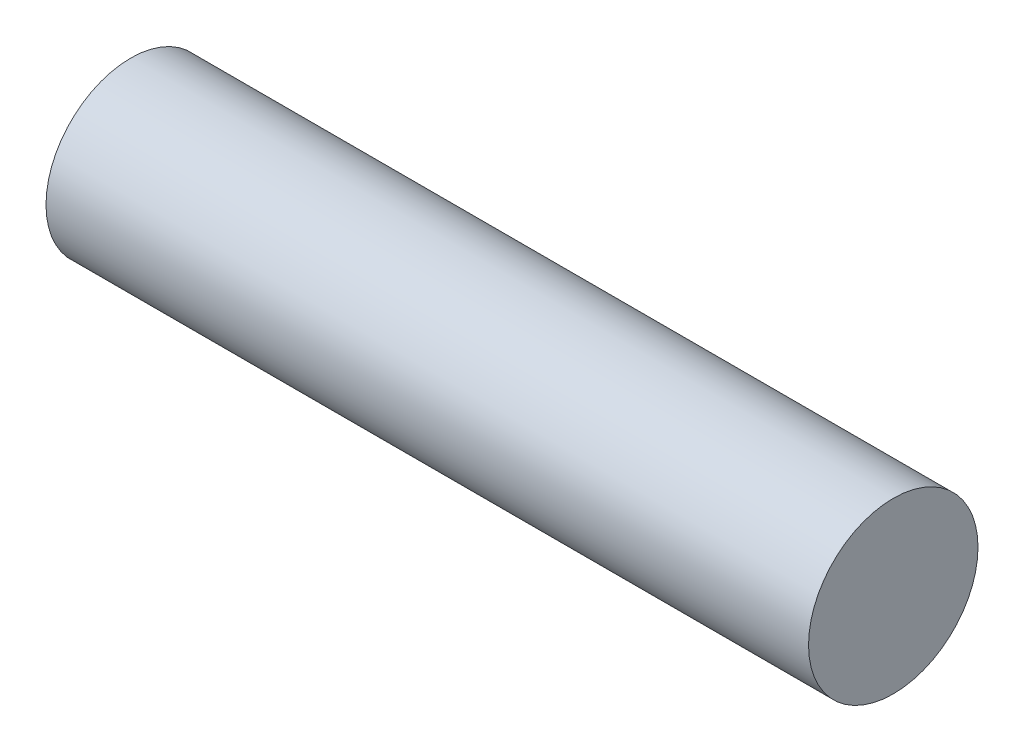
ISO-10303-21;
HEADER;
FILE_DESCRIPTION(('STEP AP214'),'2;1');
FILE_NAME('part.step','',(''),(''),'','','');
FILE_SCHEMA(('AUTOMOTIVE_DESIGN { 1 0 10303 214 1 1 1 1 }'));
ENDSEC;
DATA;
#1=APPLICATION_CONTEXT('core data for automotive mechanical design processes');
#2=APPLICATION_PROTOCOL_DEFINITION('international standard','automotive_design',2000,#1);
#3=PRODUCT_CONTEXT('',#1,'mechanical');
#4=PRODUCT('Part','Part','',(#3));
#5=PRODUCT_RELATED_PRODUCT_CATEGORY('part','',(#4));
#6=PRODUCT_DEFINITION_FORMATION('','',#4);
#7=PRODUCT_DEFINITION_CONTEXT('part definition',#1,'design');
#8=PRODUCT_DEFINITION('design','',#6,#7);
#9=PRODUCT_DEFINITION_SHAPE('','',#8);
#10=(LENGTH_UNIT() NAMED_UNIT(*) SI_UNIT(.MILLI.,.METRE.));
#11=(NAMED_UNIT(*) PLANE_ANGLE_UNIT() SI_UNIT($,.RADIAN.));
#12=(NAMED_UNIT(*) SI_UNIT($,.STERADIAN.) SOLID_ANGLE_UNIT());
#13=UNCERTAINTY_MEASURE_WITH_UNIT(LENGTH_MEASURE(1.E-05),#10,'distance_accuracy_value','');
#14=(GEOMETRIC_REPRESENTATION_CONTEXT(3) GLOBAL_UNCERTAINTY_ASSIGNED_CONTEXT((#13)) GLOBAL_UNIT_ASSIGNED_CONTEXT((#10,
#11,#12)) REPRESENTATION_CONTEXT('',''));
#15=CARTESIAN_POINT('',(0.,0.,0.));
#16=DIRECTION('',(0.,0.,1.));
#17=DIRECTION('',(1.,0.,0.));
#18=AXIS2_PLACEMENT_3D('',#15,#16,#17);
#19=CARTESIAN_POINT('',(28.575,0.,0.));
#20=DIRECTION('',(-1.,0.,0.));
#21=DIRECTION('',(0.,0.,1.));
#22=AXIS2_PLACEMENT_3D('',#19,#20,#21);
#23=CYLINDRICAL_SURFACE('',#22,6.35);
#24=CARTESIAN_POINT('',(28.575,0.,0.));
#25=DIRECTION('',(1.,0.,0.));
#26=DIRECTION('',(0.,0.,-1.));
#27=AXIS2_PLACEMENT_3D('',#24,#25,#26);
#28=CIRCLE('',#27,6.35);
#29=CARTESIAN_POINT('',(28.575,0.,-6.35));
#30=VERTEX_POINT('',#29);
#31=EDGE_CURVE('E10',#30,#30,#28,.T.);
#32=ORIENTED_EDGE('',*,*,#31,.F.);
#33=EDGE_LOOP('',(#32));
#34=FACE_BOUND('',#33,.T.);
#35=CARTESIAN_POINT('',(-28.575,0.,0.));
#36=DIRECTION('',(1.,0.,0.));
#37=DIRECTION('',(0.,0.,-1.));
#38=AXIS2_PLACEMENT_3D('',#35,#36,#37);
#39=CIRCLE('',#38,6.35);
#40=CARTESIAN_POINT('',(-28.575,0.,-6.35));
#41=VERTEX_POINT('',#40);
#42=EDGE_CURVE('E34',#41,#41,#39,.T.);
#43=ORIENTED_EDGE('',*,*,#42,.T.);
#44=EDGE_LOOP('',(#43));
#45=FACE_BOUND('',#44,.T.);
#46=ADVANCED_FACE('F31',(#34,#45),#23,.T.);
#47=CARTESIAN_POINT('',(28.575,0.,0.));
#48=DIRECTION('',(1.,0.,0.));
#49=DIRECTION('',(0.,0.,-1.));
#50=AXIS2_PLACEMENT_3D('',#47,#48,#49);
#51=PLANE('',#50);
#52=ORIENTED_EDGE('',*,*,#31,.T.);
#53=EDGE_LOOP('',(#52));
#54=FACE_BOUND('',#53,.T.);
#55=ADVANCED_FACE('F46',(#54),#51,.T.);
#56=CARTESIAN_POINT('',(-28.575,0.,0.));
#57=DIRECTION('',(1.,0.,0.));
#58=DIRECTION('',(0.,0.,-1.));
#59=AXIS2_PLACEMENT_3D('',#56,#57,#58);
#60=PLANE('',#59);
#61=ORIENTED_EDGE('',*,*,#42,.F.);
#62=EDGE_LOOP('',(#61));
#63=FACE_BOUND('',#62,.T.);
#64=ADVANCED_FACE('F44',(#63),#60,.F.);
#65=CLOSED_SHELL('',(#46,#55,#64));
#66=MANIFOLD_SOLID_BREP('B2',#65);
#67=ADVANCED_BREP_SHAPE_REPRESENTATION('',(#18,#66),#14);
#68=SHAPE_DEFINITION_REPRESENTATION(#9,#67);
ENDSEC;
END-ISO-10303-21;
